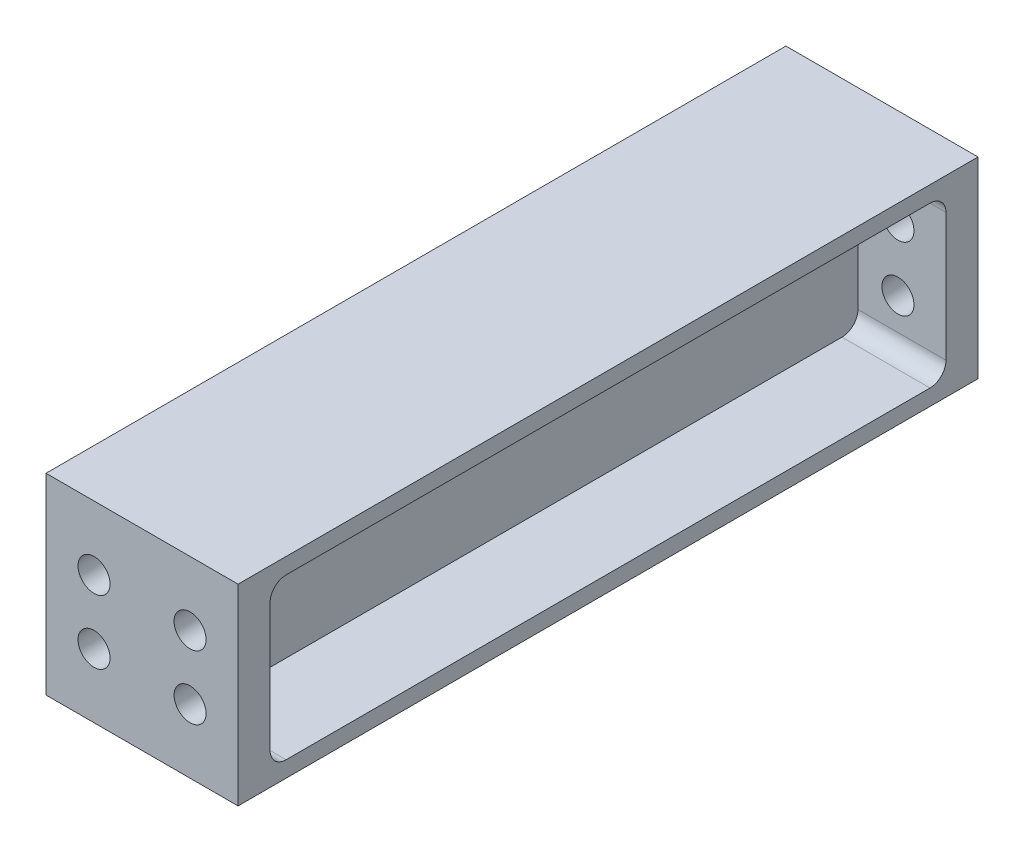
ISO-10303-21;
HEADER;
FILE_DESCRIPTION(('STEP AP214'),'2;1');
FILE_NAME('part.step','',(''),(''),'','','');
FILE_SCHEMA(('AUTOMOTIVE_DESIGN { 1 0 10303 214 1 1 1 1 }'));
ENDSEC;
DATA;
#1=APPLICATION_CONTEXT('core data for automotive mechanical design processes');
#2=APPLICATION_PROTOCOL_DEFINITION('international standard','automotive_design',2000,#1);
#3=PRODUCT_CONTEXT('',#1,'mechanical');
#4=PRODUCT('Part','Part','',(#3));
#5=PRODUCT_RELATED_PRODUCT_CATEGORY('part','',(#4));
#6=PRODUCT_DEFINITION_FORMATION('','',#4);
#7=PRODUCT_DEFINITION_CONTEXT('part definition',#1,'design');
#8=PRODUCT_DEFINITION('design','',#6,#7);
#9=PRODUCT_DEFINITION_SHAPE('','',#8);
#10=(LENGTH_UNIT() NAMED_UNIT(*) SI_UNIT(.MILLI.,.METRE.));
#11=(NAMED_UNIT(*) PLANE_ANGLE_UNIT() SI_UNIT($,.RADIAN.));
#12=(NAMED_UNIT(*) SI_UNIT($,.STERADIAN.) SOLID_ANGLE_UNIT());
#13=UNCERTAINTY_MEASURE_WITH_UNIT(LENGTH_MEASURE(1.E-05),#10,'distance_accuracy_value','');
#14=(GEOMETRIC_REPRESENTATION_CONTEXT(3) GLOBAL_UNCERTAINTY_ASSIGNED_CONTEXT((#13)) GLOBAL_UNIT_ASSIGNED_CONTEXT((#10,
#11,#12)) REPRESENTATION_CONTEXT('',''));
#15=CARTESIAN_POINT('',(0.,0.,0.));
#16=DIRECTION('',(0.,0.,1.));
#17=DIRECTION('',(1.,0.,0.));
#18=AXIS2_PLACEMENT_3D('',#15,#16,#17);
#19=CARTESIAN_POINT('',(0.,0.,146.76501));
#20=DIRECTION('',(1.,0.,0.));
#21=DIRECTION('',(0.,0.,-1.));
#22=AXIS2_PLACEMENT_3D('',#19,#20,#21);
#23=PLANE('',#22);
#24=DIRECTION('',(0.,-1.,0.));
#25=VECTOR('',#24,1.);
#26=CARTESIAN_POINT('',(0.,0.,0.));
#27=LINE('',#26,#25);
#28=CARTESIAN_POINT('',(0.,38.1,0.));
#29=VERTEX_POINT('',#28);
#30=CARTESIAN_POINT('',(0.,0.,0.));
#31=VERTEX_POINT('',#30);
#32=EDGE_CURVE('E196',#29,#31,#27,.T.);
#33=ORIENTED_EDGE('',*,*,#32,.T.);
#34=DIRECTION('',(0.,0.,-1.));
#35=VECTOR('',#34,1.);
#36=CARTESIAN_POINT('',(0.,0.,146.76501));
#37=LINE('',#36,#35);
#38=CARTESIAN_POINT('',(0.,0.,146.76501));
#39=VERTEX_POINT('',#38);
#40=EDGE_CURVE('E177',#39,#31,#37,.T.);
#41=ORIENTED_EDGE('',*,*,#40,.F.);
#42=DIRECTION('',(0.,-1.,0.));
#43=VECTOR('',#42,1.);
#44=CARTESIAN_POINT('',(0.,0.,146.76501));
#45=LINE('',#44,#43);
#46=CARTESIAN_POINT('',(0.,38.1,146.76501));
#47=VERTEX_POINT('',#46);
#48=EDGE_CURVE('E184',#47,#39,#45,.T.);
#49=ORIENTED_EDGE('',*,*,#48,.F.);
#50=DIRECTION('',(0.,0.,-1.));
#51=VECTOR('',#50,1.);
#52=CARTESIAN_POINT('',(0.,38.1,146.76501));
#53=LINE('',#52,#51);
#54=EDGE_CURVE('E347',#47,#29,#53,.T.);
#55=ORIENTED_EDGE('',*,*,#54,.T.);
#56=EDGE_LOOP('',(#33,#41,#49,#55));
#57=FACE_BOUND('',#56,.T.);
#58=DIRECTION('',(0.,0.,1.));
#59=VECTOR('',#58,1.);
#60=CARTESIAN_POINT('',(0.,34.925,140.41501));
#61=LINE('',#60,#59);
#62=CARTESIAN_POINT('',(0.,34.925,9.52499999999998));
#63=VERTEX_POINT('',#62);
#64=CARTESIAN_POINT('',(0.,34.925,137.24001));
#65=VERTEX_POINT('',#64);
#66=EDGE_CURVE('E316',#63,#65,#61,.T.);
#67=ORIENTED_EDGE('',*,*,#66,.T.);
#68=CARTESIAN_POINT('',(0.,31.75,137.24001));
#69=DIRECTION('',(1.,0.,0.));
#70=DIRECTION('',(0.,0.,-1.));
#71=AXIS2_PLACEMENT_3D('',#68,#69,#70);
#72=CIRCLE('',#71,3.175);
#73=CARTESIAN_POINT('',(0.,31.75,140.41501));
#74=VERTEX_POINT('',#73);
#75=EDGE_CURVE('E44',#65,#74,#72,.T.);
#76=ORIENTED_EDGE('',*,*,#75,.T.);
#77=DIRECTION('',(0.,-1.,0.));
#78=VECTOR('',#77,1.);
#79=CARTESIAN_POINT('',(0.,34.925,140.41501));
#80=LINE('',#79,#78);
#81=CARTESIAN_POINT('',(0.,6.35,140.41501));
#82=VERTEX_POINT('',#81);
#83=EDGE_CURVE('E299',#74,#82,#80,.T.);
#84=ORIENTED_EDGE('',*,*,#83,.T.);
#85=CARTESIAN_POINT('',(0.,6.35,137.24001));
#86=DIRECTION('',(1.,0.,0.));
#87=DIRECTION('',(0.,0.,-1.));
#88=AXIS2_PLACEMENT_3D('',#85,#86,#87);
#89=CIRCLE('',#88,3.175);
#90=CARTESIAN_POINT('',(0.,3.175,137.24001));
#91=VERTEX_POINT('',#90);
#92=EDGE_CURVE('E267',#82,#91,#89,.T.);
#93=ORIENTED_EDGE('',*,*,#92,.T.);
#94=DIRECTION('',(0.,0.,-1.));
#95=VECTOR('',#94,1.);
#96=CARTESIAN_POINT('',(0.,3.175,140.41501));
#97=LINE('',#96,#95);
#98=CARTESIAN_POINT('',(0.,3.17499999999998,9.52499999999998));
#99=VERTEX_POINT('',#98);
#100=EDGE_CURVE('E304',#91,#99,#97,.T.);
#101=ORIENTED_EDGE('',*,*,#100,.T.);
#102=CARTESIAN_POINT('',(0.,6.34999999999998,9.52499999999998));
#103=DIRECTION('',(1.,0.,0.));
#104=DIRECTION('',(0.,0.,-1.));
#105=AXIS2_PLACEMENT_3D('',#102,#103,#104);
#106=CIRCLE('',#105,3.175);
#107=CARTESIAN_POINT('',(0.,6.34999999999998,6.34999999999997));
#108=VERTEX_POINT('',#107);
#109=EDGE_CURVE('E265',#99,#108,#106,.T.);
#110=ORIENTED_EDGE('',*,*,#109,.T.);
#111=DIRECTION('',(0.,1.,0.));
#112=VECTOR('',#111,1.);
#113=CARTESIAN_POINT('',(0.,34.925,6.34999999999997));
#114=LINE('',#113,#112);
#115=CARTESIAN_POINT('',(0.,31.75,6.34999999999997));
#116=VERTEX_POINT('',#115);
#117=EDGE_CURVE('E318',#108,#116,#114,.T.);
#118=ORIENTED_EDGE('',*,*,#117,.T.);
#119=CARTESIAN_POINT('',(0.,31.75,9.52499999999997));
#120=DIRECTION('',(1.,0.,0.));
#121=DIRECTION('',(0.,0.,-1.));
#122=AXIS2_PLACEMENT_3D('',#119,#120,#121);
#123=CIRCLE('',#122,3.175);
#124=EDGE_CURVE('E11',#116,#63,#123,.T.);
#125=ORIENTED_EDGE('',*,*,#124,.T.);
#126=EDGE_LOOP('',(#67,#76,#84,#93,#101,#110,#118,#125));
#127=FACE_BOUND('',#126,.T.);
#128=ADVANCED_FACE('F35',(#57,#127),#23,.F.);
#129=CARTESIAN_POINT('',(0.,0.,146.76501));
#130=DIRECTION('',(0.,1.,0.));
#131=DIRECTION('',(0.,0.,1.));
#132=AXIS2_PLACEMENT_3D('',#129,#130,#131);
#133=PLANE('',#132);
#134=DIRECTION('',(1.,0.,0.));
#135=VECTOR('',#134,1.);
#136=CARTESIAN_POINT('',(0.,0.,0.));
#137=LINE('',#136,#135);
#138=CARTESIAN_POINT('',(38.1,0.,0.));
#139=VERTEX_POINT('',#138);
#140=EDGE_CURVE('E349',#31,#139,#137,.T.);
#141=ORIENTED_EDGE('',*,*,#140,.T.);
#142=DIRECTION('',(0.,0.,-1.));
#143=VECTOR('',#142,1.);
#144=CARTESIAN_POINT('',(38.1,0.,146.76501));
#145=LINE('',#144,#143);
#146=CARTESIAN_POINT('',(38.1,0.,146.76501));
#147=VERTEX_POINT('',#146);
#148=EDGE_CURVE('E180',#147,#139,#145,.T.);
#149=ORIENTED_EDGE('',*,*,#148,.F.);
#150=DIRECTION('',(1.,0.,0.));
#151=VECTOR('',#150,1.);
#152=CARTESIAN_POINT('',(0.,0.,146.76501));
#153=LINE('',#152,#151);
#154=EDGE_CURVE('E173',#39,#147,#153,.T.);
#155=ORIENTED_EDGE('',*,*,#154,.F.);
#156=ORIENTED_EDGE('',*,*,#40,.T.);
#157=EDGE_LOOP('',(#141,#149,#155,#156));
#158=FACE_BOUND('',#157,.T.);
#159=ADVANCED_FACE('F175',(#158),#133,.F.);
#160=CARTESIAN_POINT('',(38.1,0.,146.76501));
#161=DIRECTION('',(-1.,0.,0.));
#162=DIRECTION('',(0.,0.,1.));
#163=AXIS2_PLACEMENT_3D('',#160,#161,#162);
#164=PLANE('',#163);
#165=DIRECTION('',(0.,0.,-1.));
#166=VECTOR('',#165,1.);
#167=CARTESIAN_POINT('',(38.1,3.175,140.41501));
#168=LINE('',#167,#166);
#169=CARTESIAN_POINT('',(38.1,3.175,137.24001));
#170=VERTEX_POINT('',#169);
#171=CARTESIAN_POINT('',(38.1,3.17499999999998,9.52499999999998));
#172=VERTEX_POINT('',#171);
#173=EDGE_CURVE('E337',#170,#172,#168,.T.);
#174=ORIENTED_EDGE('',*,*,#173,.F.);
#175=CARTESIAN_POINT('',(38.1,6.35,137.24001));
#176=DIRECTION('',(-1.,0.,0.));
#177=DIRECTION('',(0.,0.,1.));
#178=AXIS2_PLACEMENT_3D('',#175,#176,#177);
#179=CIRCLE('',#178,3.175);
#180=CARTESIAN_POINT('',(38.1,6.35,140.41501));
#181=VERTEX_POINT('',#180);
#182=EDGE_CURVE('E232',#170,#181,#179,.T.);
#183=ORIENTED_EDGE('',*,*,#182,.T.);
#184=DIRECTION('',(0.,-1.,0.));
#185=VECTOR('',#184,1.);
#186=CARTESIAN_POINT('',(38.1,34.925,140.41501));
#187=LINE('',#186,#185);
#188=CARTESIAN_POINT('',(38.1,31.75,140.41501));
#189=VERTEX_POINT('',#188);
#190=EDGE_CURVE('E313',#189,#181,#187,.T.);
#191=ORIENTED_EDGE('',*,*,#190,.F.);
#192=CARTESIAN_POINT('',(38.1,31.75,137.24001));
#193=DIRECTION('',(-1.,0.,0.));
#194=DIRECTION('',(0.,0.,1.));
#195=AXIS2_PLACEMENT_3D('',#192,#193,#194);
#196=CIRCLE('',#195,3.175);
#197=CARTESIAN_POINT('',(38.1,34.925,137.24001));
#198=VERTEX_POINT('',#197);
#199=EDGE_CURVE('E234',#189,#198,#196,.T.);
#200=ORIENTED_EDGE('',*,*,#199,.T.);
#201=DIRECTION('',(0.,0.,1.));
#202=VECTOR('',#201,1.);
#203=CARTESIAN_POINT('',(38.1,34.925,140.41501));
#204=LINE('',#203,#202);
#205=CARTESIAN_POINT('',(38.1,34.925,9.52499999999998));
#206=VERTEX_POINT('',#205);
#207=EDGE_CURVE('E326',#206,#198,#204,.T.);
#208=ORIENTED_EDGE('',*,*,#207,.F.);
#209=CARTESIAN_POINT('',(38.1,31.75,9.52499999999998));
#210=DIRECTION('',(-1.,0.,0.));
#211=DIRECTION('',(0.,0.,1.));
#212=AXIS2_PLACEMENT_3D('',#209,#210,#211);
#213=CIRCLE('',#212,3.175);
#214=CARTESIAN_POINT('',(38.1,31.75,6.34999999999997));
#215=VERTEX_POINT('',#214);
#216=EDGE_CURVE('E236',#206,#215,#213,.T.);
#217=ORIENTED_EDGE('',*,*,#216,.T.);
#218=DIRECTION('',(0.,1.,0.));
#219=VECTOR('',#218,1.);
#220=CARTESIAN_POINT('',(38.1,34.925,6.34999999999997));
#221=LINE('',#220,#219);
#222=CARTESIAN_POINT('',(38.1,6.34999999999998,6.34999999999997));
#223=VERTEX_POINT('',#222);
#224=EDGE_CURVE('E340',#223,#215,#221,.T.);
#225=ORIENTED_EDGE('',*,*,#224,.F.);
#226=CARTESIAN_POINT('',(38.1,6.34999999999998,9.52499999999997));
#227=DIRECTION('',(-1.,0.,0.));
#228=DIRECTION('',(0.,0.,1.));
#229=AXIS2_PLACEMENT_3D('',#226,#227,#228);
#230=CIRCLE('',#229,3.175);
#231=EDGE_CURVE('E230',#223,#172,#230,.T.);
#232=ORIENTED_EDGE('',*,*,#231,.T.);
#233=EDGE_LOOP('',(#174,#183,#191,#200,#208,#217,#225,#232));
#234=FACE_BOUND('',#233,.T.);
#235=DIRECTION('',(0.,1.,0.));
#236=VECTOR('',#235,1.);
#237=CARTESIAN_POINT('',(38.1,0.,0.));
#238=LINE('',#237,#236);
#239=CARTESIAN_POINT('',(38.1,38.1,0.));
#240=VERTEX_POINT('',#239);
#241=EDGE_CURVE('E351',#139,#240,#238,.T.);
#242=ORIENTED_EDGE('',*,*,#241,.T.);
#243=DIRECTION('',(0.,0.,-1.));
#244=VECTOR('',#243,1.);
#245=CARTESIAN_POINT('',(38.1,38.1,146.76501));
#246=LINE('',#245,#244);
#247=CARTESIAN_POINT('',(38.1,38.1,146.76501));
#248=VERTEX_POINT('',#247);
#249=EDGE_CURVE('E201',#248,#240,#246,.T.);
#250=ORIENTED_EDGE('',*,*,#249,.F.);
#251=DIRECTION('',(0.,1.,0.));
#252=VECTOR('',#251,1.);
#253=CARTESIAN_POINT('',(38.1,0.,146.76501));
#254=LINE('',#253,#252);
#255=EDGE_CURVE('E183',#147,#248,#254,.T.);
#256=ORIENTED_EDGE('',*,*,#255,.F.);
#257=ORIENTED_EDGE('',*,*,#148,.T.);
#258=EDGE_LOOP('',(#242,#250,#256,#257));
#259=FACE_BOUND('',#258,.T.);
#260=ADVANCED_FACE('F363',(#234,#259),#164,.F.);
#261=CARTESIAN_POINT('',(0.,38.1,146.76501));
#262=DIRECTION('',(0.,-1.,0.));
#263=DIRECTION('',(0.,0.,-1.));
#264=AXIS2_PLACEMENT_3D('',#261,#262,#263);
#265=PLANE('',#264);
#266=DIRECTION('',(-1.,0.,0.));
#267=VECTOR('',#266,1.);
#268=CARTESIAN_POINT('',(0.,38.1,0.));
#269=LINE('',#268,#267);
#270=EDGE_CURVE('E193',#240,#29,#269,.T.);
#271=ORIENTED_EDGE('',*,*,#270,.T.);
#272=ORIENTED_EDGE('',*,*,#54,.F.);
#273=DIRECTION('',(-1.,0.,0.));
#274=VECTOR('',#273,1.);
#275=CARTESIAN_POINT('',(0.,38.1,146.76501));
#276=LINE('',#275,#274);
#277=EDGE_CURVE('E189',#248,#47,#276,.T.);
#278=ORIENTED_EDGE('',*,*,#277,.F.);
#279=ORIENTED_EDGE('',*,*,#249,.T.);
#280=EDGE_LOOP('',(#271,#272,#278,#279));
#281=FACE_BOUND('',#280,.T.);
#282=ADVANCED_FACE('F358',(#281),#265,.F.);
#283=CARTESIAN_POINT('',(0.,0.,146.76501));
#284=DIRECTION('',(0.,0.,-1.));
#285=DIRECTION('',(-1.,0.,0.));
#286=AXIS2_PLACEMENT_3D('',#283,#284,#285);
#287=PLANE('',#286);
#288=CARTESIAN_POINT('',(9.525,25.4,146.76501));
#289=DIRECTION('',(0.,0.,-1.));
#290=DIRECTION('',(-1.,0.,0.));
#291=AXIS2_PLACEMENT_3D('',#288,#289,#290);
#292=CIRCLE('',#291,3.17499999999993);
#293=CARTESIAN_POINT('',(6.35000000000007,25.4,146.76501));
#294=VERTEX_POINT('',#293);
#295=EDGE_CURVE('E547',#294,#294,#292,.T.);
#296=ORIENTED_EDGE('',*,*,#295,.T.);
#297=EDGE_LOOP('',(#296));
#298=FACE_BOUND('',#297,.T.);
#299=CARTESIAN_POINT('',(9.525,12.7,146.76501));
#300=DIRECTION('',(0.,0.,-1.));
#301=DIRECTION('',(-1.,0.,0.));
#302=AXIS2_PLACEMENT_3D('',#299,#300,#301);
#303=CIRCLE('',#302,3.17499999999993);
#304=CARTESIAN_POINT('',(6.35000000000007,12.7,146.76501));
#305=VERTEX_POINT('',#304);
#306=EDGE_CURVE('E537',#305,#305,#303,.T.);
#307=ORIENTED_EDGE('',*,*,#306,.T.);
#308=EDGE_LOOP('',(#307));
#309=FACE_BOUND('',#308,.T.);
#310=CARTESIAN_POINT('',(28.575,12.7,146.76501));
#311=DIRECTION('',(0.,0.,-1.));
#312=DIRECTION('',(-1.,0.,0.));
#313=AXIS2_PLACEMENT_3D('',#310,#311,#312);
#314=CIRCLE('',#313,3.17499999999993);
#315=CARTESIAN_POINT('',(25.4000000000001,12.7,146.76501));
#316=VERTEX_POINT('',#315);
#317=EDGE_CURVE('E277',#316,#316,#314,.T.);
#318=ORIENTED_EDGE('',*,*,#317,.T.);
#319=EDGE_LOOP('',(#318));
#320=FACE_BOUND('',#319,.T.);
#321=CARTESIAN_POINT('',(28.575,25.4,146.76501));
#322=DIRECTION('',(0.,0.,-1.));
#323=DIRECTION('',(-1.,0.,0.));
#324=AXIS2_PLACEMENT_3D('',#321,#322,#323);
#325=CIRCLE('',#324,3.17499999999993);
#326=CARTESIAN_POINT('',(25.4000000000001,25.4,146.76501));
#327=VERTEX_POINT('',#326);
#328=EDGE_CURVE('E273',#327,#327,#325,.T.);
#329=ORIENTED_EDGE('',*,*,#328,.T.);
#330=EDGE_LOOP('',(#329));
#331=FACE_BOUND('',#330,.T.);
#332=ORIENTED_EDGE('',*,*,#48,.T.);
#333=ORIENTED_EDGE('',*,*,#154,.T.);
#334=ORIENTED_EDGE('',*,*,#255,.T.);
#335=ORIENTED_EDGE('',*,*,#277,.T.);
#336=EDGE_LOOP('',(#332,#333,#334,#335));
#337=FACE_BOUND('',#336,.T.);
#338=ADVANCED_FACE('F187',(#298,#309,#320,#331,#337),#287,.F.);
#339=CARTESIAN_POINT('',(0.,0.,0.));
#340=DIRECTION('',(0.,0.,-1.));
#341=DIRECTION('',(-1.,0.,0.));
#342=AXIS2_PLACEMENT_3D('',#339,#340,#341);
#343=PLANE('',#342);
#344=CARTESIAN_POINT('',(9.525,25.4,0.));
#345=DIRECTION('',(0.,0.,-1.));
#346=DIRECTION('',(-1.,0.,0.));
#347=AXIS2_PLACEMENT_3D('',#344,#345,#346);
#348=CIRCLE('',#347,3.17499999999999);
#349=CARTESIAN_POINT('',(6.35000000000001,25.4,0.));
#350=VERTEX_POINT('',#349);
#351=EDGE_CURVE('E477',#350,#350,#348,.T.);
#352=ORIENTED_EDGE('',*,*,#351,.F.);
#353=EDGE_LOOP('',(#352));
#354=FACE_BOUND('',#353,.T.);
#355=CARTESIAN_POINT('',(9.525,12.7,0.));
#356=DIRECTION('',(0.,0.,-1.));
#357=DIRECTION('',(-1.,0.,0.));
#358=AXIS2_PLACEMENT_3D('',#355,#356,#357);
#359=CIRCLE('',#358,3.17499999999999);
#360=CARTESIAN_POINT('',(6.35000000000001,12.7,0.));
#361=VERTEX_POINT('',#360);
#362=EDGE_CURVE('E481',#361,#361,#359,.T.);
#363=ORIENTED_EDGE('',*,*,#362,.F.);
#364=EDGE_LOOP('',(#363));
#365=FACE_BOUND('',#364,.T.);
#366=CARTESIAN_POINT('',(28.575,12.7,0.));
#367=DIRECTION('',(0.,0.,-1.));
#368=DIRECTION('',(-1.,0.,0.));
#369=AXIS2_PLACEMENT_3D('',#366,#367,#368);
#370=CIRCLE('',#369,3.17499999999998);
#371=CARTESIAN_POINT('',(25.4,12.7,0.));
#372=VERTEX_POINT('',#371);
#373=EDGE_CURVE('E284',#372,#372,#370,.T.);
#374=ORIENTED_EDGE('',*,*,#373,.F.);
#375=EDGE_LOOP('',(#374));
#376=FACE_BOUND('',#375,.T.);
#377=CARTESIAN_POINT('',(28.575,25.4,0.));
#378=DIRECTION('',(0.,0.,-1.));
#379=DIRECTION('',(-1.,0.,0.));
#380=AXIS2_PLACEMENT_3D('',#377,#378,#379);
#381=CIRCLE('',#380,3.17499999999998);
#382=CARTESIAN_POINT('',(25.4,25.4,0.));
#383=VERTEX_POINT('',#382);
#384=EDGE_CURVE('E281',#383,#383,#381,.T.);
#385=ORIENTED_EDGE('',*,*,#384,.F.);
#386=EDGE_LOOP('',(#385));
#387=FACE_BOUND('',#386,.T.);
#388=ORIENTED_EDGE('',*,*,#32,.F.);
#389=ORIENTED_EDGE('',*,*,#270,.F.);
#390=ORIENTED_EDGE('',*,*,#241,.F.);
#391=ORIENTED_EDGE('',*,*,#140,.F.);
#392=EDGE_LOOP('',(#388,#389,#390,#391));
#393=FACE_BOUND('',#392,.T.);
#394=ADVANCED_FACE('F362',(#354,#365,#376,#387,#393),#343,.T.);
#395=CARTESIAN_POINT('',(20.6375,34.925,140.41501));
#396=DIRECTION('',(0.,0.,1.));
#397=DIRECTION('',(1.,0.,0.));
#398=AXIS2_PLACEMENT_3D('',#395,#396,#397);
#399=PLANE('',#398);
#400=CARTESIAN_POINT('',(28.575,12.7,140.41501));
#401=DIRECTION('',(0.,0.,1.));
#402=DIRECTION('',(1.,0.,0.));
#403=AXIS2_PLACEMENT_3D('',#400,#401,#402);
#404=CIRCLE('',#403,3.17499999999996);
#405=CARTESIAN_POINT('',(31.75,12.7,140.41501));
#406=VERTEX_POINT('',#405);
#407=EDGE_CURVE('E276',#406,#406,#404,.T.);
#408=ORIENTED_EDGE('',*,*,#407,.T.);
#409=EDGE_LOOP('',(#408));
#410=FACE_BOUND('',#409,.T.);
#411=CARTESIAN_POINT('',(28.575,25.4,140.41501));
#412=DIRECTION('',(0.,0.,1.));
#413=DIRECTION('',(1.,0.,0.));
#414=AXIS2_PLACEMENT_3D('',#411,#412,#413);
#415=CIRCLE('',#414,3.17499999999996);
#416=CARTESIAN_POINT('',(31.75,25.4,140.41501));
#417=VERTEX_POINT('',#416);
#418=EDGE_CURVE('E270',#417,#417,#415,.T.);
#419=ORIENTED_EDGE('',*,*,#418,.T.);
#420=EDGE_LOOP('',(#419));
#421=FACE_BOUND('',#420,.T.);
#422=ORIENTED_EDGE('',*,*,#190,.T.);
#423=DIRECTION('',(1.,0.,0.));
#424=VECTOR('',#423,1.);
#425=CARTESIAN_POINT('',(20.6375,6.35,140.41501));
#426=LINE('',#425,#424);
#427=CARTESIAN_POINT('',(20.6375,6.35,140.41501));
#428=VERTEX_POINT('',#427);
#429=EDGE_CURVE('E223',#181,#428,#426,.F.);
#430=ORIENTED_EDGE('',*,*,#429,.T.);
#431=DIRECTION('',(0.,-1.,0.));
#432=VECTOR('',#431,1.);
#433=CARTESIAN_POINT('',(20.6375,34.925,140.41501));
#434=LINE('',#433,#432);
#435=CARTESIAN_POINT('',(20.6375,31.75,140.41501));
#436=VERTEX_POINT('',#435);
#437=EDGE_CURVE('E322',#436,#428,#434,.T.);
#438=ORIENTED_EDGE('',*,*,#437,.F.);
#439=DIRECTION('',(1.,0.,0.));
#440=VECTOR('',#439,1.);
#441=CARTESIAN_POINT('',(38.1,31.75,140.41501));
#442=LINE('',#441,#440);
#443=EDGE_CURVE('E220',#436,#189,#442,.T.);
#444=ORIENTED_EDGE('',*,*,#443,.T.);
#445=EDGE_LOOP('',(#422,#430,#438,#444));
#446=FACE_BOUND('',#445,.T.);
#447=ADVANCED_FACE('F457',(#410,#421,#446),#399,.F.);
#448=CARTESIAN_POINT('',(20.6375,34.925,140.41501));
#449=DIRECTION('',(0.,1.,0.));
#450=DIRECTION('',(0.,0.,1.));
#451=AXIS2_PLACEMENT_3D('',#448,#449,#450);
#452=PLANE('',#451);
#453=ORIENTED_EDGE('',*,*,#207,.T.);
#454=DIRECTION('',(1.,0.,0.));
#455=VECTOR('',#454,1.);
#456=CARTESIAN_POINT('',(20.6375,34.925,137.24001));
#457=LINE('',#456,#455);
#458=CARTESIAN_POINT('',(20.6375,34.925,137.24001));
#459=VERTEX_POINT('',#458);
#460=EDGE_CURVE('E228',#198,#459,#457,.F.);
#461=ORIENTED_EDGE('',*,*,#460,.T.);
#462=DIRECTION('',(0.,0.,1.));
#463=VECTOR('',#462,1.);
#464=CARTESIAN_POINT('',(20.6375,34.925,140.41501));
#465=LINE('',#464,#463);
#466=CARTESIAN_POINT('',(20.6375,34.925,9.52499999999998));
#467=VERTEX_POINT('',#466);
#468=EDGE_CURVE('E332',#467,#459,#465,.T.);
#469=ORIENTED_EDGE('',*,*,#468,.F.);
#470=DIRECTION('',(1.,0.,0.));
#471=VECTOR('',#470,1.);
#472=CARTESIAN_POINT('',(38.1,34.925,9.52499999999998));
#473=LINE('',#472,#471);
#474=EDGE_CURVE('E225',#467,#206,#473,.T.);
#475=ORIENTED_EDGE('',*,*,#474,.T.);
#476=EDGE_LOOP('',(#453,#461,#469,#475));
#477=FACE_BOUND('',#476,.T.);
#478=ADVANCED_FACE('F453',(#477),#452,.F.);
#479=CARTESIAN_POINT('',(20.6375,34.925,6.34999999999997));
#480=DIRECTION('',(0.,0.,-1.));
#481=DIRECTION('',(-1.,0.,0.));
#482=AXIS2_PLACEMENT_3D('',#479,#480,#481);
#483=PLANE('',#482);
#484=CARTESIAN_POINT('',(28.575,12.7,6.34999999999997));
#485=DIRECTION('',(0.,0.,-1.));
#486=DIRECTION('',(-1.,0.,0.));
#487=AXIS2_PLACEMENT_3D('',#484,#485,#486);
#488=CIRCLE('',#487,3.17499999999996);
#489=CARTESIAN_POINT('',(25.4,12.7,6.34999999999997));
#490=VERTEX_POINT('',#489);
#491=EDGE_CURVE('E274',#490,#490,#488,.T.);
#492=ORIENTED_EDGE('',*,*,#491,.T.);
#493=EDGE_LOOP('',(#492));
#494=FACE_BOUND('',#493,.T.);
#495=CARTESIAN_POINT('',(28.575,25.4,6.34999999999997));
#496=DIRECTION('',(0.,0.,-1.));
#497=DIRECTION('',(-1.,0.,0.));
#498=AXIS2_PLACEMENT_3D('',#495,#496,#497);
#499=CIRCLE('',#498,3.17499999999996);
#500=CARTESIAN_POINT('',(25.4,25.4,6.34999999999997));
#501=VERTEX_POINT('',#500);
#502=EDGE_CURVE('E272',#501,#501,#499,.T.);
#503=ORIENTED_EDGE('',*,*,#502,.T.);
#504=EDGE_LOOP('',(#503));
#505=FACE_BOUND('',#504,.T.);
#506=DIRECTION('',(0.,1.,0.));
#507=VECTOR('',#506,1.);
#508=CARTESIAN_POINT('',(20.6375,34.925,6.34999999999997));
#509=LINE('',#508,#507);
#510=CARTESIAN_POINT('',(20.6375,6.34999999999998,6.34999999999997));
#511=VERTEX_POINT('',#510);
#512=CARTESIAN_POINT('',(20.6375,31.75,6.34999999999997));
#513=VERTEX_POINT('',#512);
#514=EDGE_CURVE('E329',#511,#513,#509,.T.);
#515=ORIENTED_EDGE('',*,*,#514,.F.);
#516=DIRECTION('',(1.,0.,0.));
#517=VECTOR('',#516,1.);
#518=CARTESIAN_POINT('',(38.1,6.34999999999998,6.34999999999997));
#519=LINE('',#518,#517);
#520=EDGE_CURVE('E199',#511,#223,#519,.T.);
#521=ORIENTED_EDGE('',*,*,#520,.T.);
#522=ORIENTED_EDGE('',*,*,#224,.T.);
#523=DIRECTION('',(1.,0.,0.));
#524=VECTOR('',#523,1.);
#525=CARTESIAN_POINT('',(20.6375,31.75,6.34999999999997));
#526=LINE('',#525,#524);
#527=EDGE_CURVE('E197',#215,#513,#526,.F.);
#528=ORIENTED_EDGE('',*,*,#527,.T.);
#529=EDGE_LOOP('',(#515,#521,#522,#528));
#530=FACE_BOUND('',#529,.T.);
#531=ADVANCED_FACE('F456',(#494,#505,#530),#483,.F.);
#532=CARTESIAN_POINT('',(20.6375,3.175,140.41501));
#533=DIRECTION('',(0.,-1.,0.));
#534=DIRECTION('',(0.,0.,-1.));
#535=AXIS2_PLACEMENT_3D('',#532,#533,#534);
#536=PLANE('',#535);
#537=ORIENTED_EDGE('',*,*,#173,.T.);
#538=DIRECTION('',(1.,0.,0.));
#539=VECTOR('',#538,1.);
#540=CARTESIAN_POINT('',(20.6375,3.17499999999998,9.52499999999997));
#541=LINE('',#540,#539);
#542=CARTESIAN_POINT('',(20.6375,3.17499999999998,9.52499999999998));
#543=VERTEX_POINT('',#542);
#544=EDGE_CURVE('E210',#172,#543,#541,.F.);
#545=ORIENTED_EDGE('',*,*,#544,.T.);
#546=DIRECTION('',(0.,0.,-1.));
#547=VECTOR('',#546,1.);
#548=CARTESIAN_POINT('',(20.6375,3.175,140.41501));
#549=LINE('',#548,#547);
#550=CARTESIAN_POINT('',(20.6375,3.175,137.24001));
#551=VERTEX_POINT('',#550);
#552=EDGE_CURVE('E325',#551,#543,#549,.T.);
#553=ORIENTED_EDGE('',*,*,#552,.F.);
#554=DIRECTION('',(1.,0.,0.));
#555=VECTOR('',#554,1.);
#556=CARTESIAN_POINT('',(38.1,3.175,137.24001));
#557=LINE('',#556,#555);
#558=EDGE_CURVE('E207',#551,#170,#557,.T.);
#559=ORIENTED_EDGE('',*,*,#558,.T.);
#560=EDGE_LOOP('',(#537,#545,#553,#559));
#561=FACE_BOUND('',#560,.T.);
#562=ADVANCED_FACE('F451',(#561),#536,.F.);
#563=CARTESIAN_POINT('',(20.6375,0.,0.));
#564=DIRECTION('',(1.,0.,0.));
#565=DIRECTION('',(0.,0.,-1.));
#566=AXIS2_PLACEMENT_3D('',#563,#564,#565);
#567=PLANE('',#566);
#568=ORIENTED_EDGE('',*,*,#552,.T.);
#569=CARTESIAN_POINT('',(20.6375,6.34999999999998,9.52499999999997));
#570=DIRECTION('',(1.,0.,0.));
#571=DIRECTION('',(0.,0.,-1.));
#572=AXIS2_PLACEMENT_3D('',#569,#570,#571);
#573=CIRCLE('',#572,3.175);
#574=EDGE_CURVE('E218',#543,#511,#573,.T.);
#575=ORIENTED_EDGE('',*,*,#574,.T.);
#576=ORIENTED_EDGE('',*,*,#514,.T.);
#577=CARTESIAN_POINT('',(20.6375,31.75,9.52499999999998));
#578=DIRECTION('',(1.,0.,0.));
#579=DIRECTION('',(0.,0.,-1.));
#580=AXIS2_PLACEMENT_3D('',#577,#578,#579);
#581=CIRCLE('',#580,3.175);
#582=EDGE_CURVE('E212',#513,#467,#581,.T.);
#583=ORIENTED_EDGE('',*,*,#582,.T.);
#584=ORIENTED_EDGE('',*,*,#468,.T.);
#585=CARTESIAN_POINT('',(20.6375,31.75,137.24001));
#586=DIRECTION('',(1.,0.,0.));
#587=DIRECTION('',(0.,0.,-1.));
#588=AXIS2_PLACEMENT_3D('',#585,#586,#587);
#589=CIRCLE('',#588,3.175);
#590=EDGE_CURVE('E214',#459,#436,#589,.T.);
#591=ORIENTED_EDGE('',*,*,#590,.T.);
#592=ORIENTED_EDGE('',*,*,#437,.T.);
#593=CARTESIAN_POINT('',(20.6375,6.35,137.24001));
#594=DIRECTION('',(1.,0.,0.));
#595=DIRECTION('',(0.,0.,-1.));
#596=AXIS2_PLACEMENT_3D('',#593,#594,#595);
#597=CIRCLE('',#596,3.175);
#598=EDGE_CURVE('E216',#428,#551,#597,.T.);
#599=ORIENTED_EDGE('',*,*,#598,.T.);
#600=EDGE_LOOP('',(#568,#575,#576,#583,#584,#591,#592,#599));
#601=FACE_BOUND('',#600,.T.);
#602=ADVANCED_FACE('F383',(#601),#567,.T.);
#603=CARTESIAN_POINT('',(20.6375,6.34999999999998,9.52499999999997));
#604=DIRECTION('',(-1.,0.,0.));
#605=DIRECTION('',(0.,0.,1.));
#606=AXIS2_PLACEMENT_3D('',#603,#604,#605);
#607=CYLINDRICAL_SURFACE('',#606,3.175);
#608=ORIENTED_EDGE('',*,*,#574,.F.);
#609=ORIENTED_EDGE('',*,*,#544,.F.);
#610=ORIENTED_EDGE('',*,*,#231,.F.);
#611=ORIENTED_EDGE('',*,*,#520,.F.);
#612=EDGE_LOOP('',(#608,#609,#610,#611));
#613=FACE_BOUND('',#612,.T.);
#614=ADVANCED_FACE('F379',(#613),#607,.F.);
#615=CARTESIAN_POINT('',(20.6375,6.35,137.24001));
#616=DIRECTION('',(-1.,0.,0.));
#617=DIRECTION('',(0.,0.,1.));
#618=AXIS2_PLACEMENT_3D('',#615,#616,#617);
#619=CYLINDRICAL_SURFACE('',#618,3.175);
#620=ORIENTED_EDGE('',*,*,#598,.F.);
#621=ORIENTED_EDGE('',*,*,#429,.F.);
#622=ORIENTED_EDGE('',*,*,#182,.F.);
#623=ORIENTED_EDGE('',*,*,#558,.F.);
#624=EDGE_LOOP('',(#620,#621,#622,#623));
#625=FACE_BOUND('',#624,.T.);
#626=ADVANCED_FACE('F382',(#625),#619,.F.);
#627=CARTESIAN_POINT('',(20.6375,31.75,137.24001));
#628=DIRECTION('',(-1.,0.,0.));
#629=DIRECTION('',(0.,0.,1.));
#630=AXIS2_PLACEMENT_3D('',#627,#628,#629);
#631=CYLINDRICAL_SURFACE('',#630,3.175);
#632=ORIENTED_EDGE('',*,*,#590,.F.);
#633=ORIENTED_EDGE('',*,*,#460,.F.);
#634=ORIENTED_EDGE('',*,*,#199,.F.);
#635=ORIENTED_EDGE('',*,*,#443,.F.);
#636=EDGE_LOOP('',(#632,#633,#634,#635));
#637=FACE_BOUND('',#636,.T.);
#638=ADVANCED_FACE('F387',(#637),#631,.F.);
#639=CARTESIAN_POINT('',(20.6375,31.75,9.52499999999998));
#640=DIRECTION('',(-1.,0.,0.));
#641=DIRECTION('',(0.,0.,1.));
#642=AXIS2_PLACEMENT_3D('',#639,#640,#641);
#643=CYLINDRICAL_SURFACE('',#642,3.175);
#644=ORIENTED_EDGE('',*,*,#582,.F.);
#645=ORIENTED_EDGE('',*,*,#527,.F.);
#646=ORIENTED_EDGE('',*,*,#216,.F.);
#647=ORIENTED_EDGE('',*,*,#474,.F.);
#648=EDGE_LOOP('',(#644,#645,#646,#647));
#649=FACE_BOUND('',#648,.T.);
#650=ADVANCED_FACE('F391',(#649),#643,.F.);
#651=CARTESIAN_POINT('',(17.4625,34.925,140.41501));
#652=DIRECTION('',(0.,0.,-1.));
#653=DIRECTION('',(-1.,0.,0.));
#654=AXIS2_PLACEMENT_3D('',#651,#652,#653);
#655=PLANE('',#654);
#656=CARTESIAN_POINT('',(9.525,25.4,140.41501));
#657=DIRECTION('',(0.,0.,-1.));
#658=DIRECTION('',(-1.,0.,0.));
#659=AXIS2_PLACEMENT_3D('',#656,#657,#658);
#660=CIRCLE('',#659,3.17499999999996);
#661=CARTESIAN_POINT('',(6.35000000000004,25.4,140.41501));
#662=VERTEX_POINT('',#661);
#663=EDGE_CURVE('E544',#662,#662,#660,.T.);
#664=ORIENTED_EDGE('',*,*,#663,.F.);
#665=EDGE_LOOP('',(#664));
#666=FACE_BOUND('',#665,.T.);
#667=CARTESIAN_POINT('',(9.525,12.7,140.41501));
#668=DIRECTION('',(0.,0.,-1.));
#669=DIRECTION('',(-1.,0.,0.));
#670=AXIS2_PLACEMENT_3D('',#667,#668,#669);
#671=CIRCLE('',#670,3.17499999999996);
#672=CARTESIAN_POINT('',(6.35000000000004,12.7,140.41501));
#673=VERTEX_POINT('',#672);
#674=EDGE_CURVE('E289',#673,#673,#671,.T.);
#675=ORIENTED_EDGE('',*,*,#674,.F.);
#676=EDGE_LOOP('',(#675));
#677=FACE_BOUND('',#676,.T.);
#678=DIRECTION('',(0.,-1.,0.));
#679=VECTOR('',#678,1.);
#680=CARTESIAN_POINT('',(17.4625,34.925,140.41501));
#681=LINE('',#680,#679);
#682=CARTESIAN_POINT('',(17.4625,31.75,140.41501));
#683=VERTEX_POINT('',#682);
#684=CARTESIAN_POINT('',(17.4625,6.35,140.41501));
#685=VERTEX_POINT('',#684);
#686=EDGE_CURVE('E300',#683,#685,#681,.T.);
#687=ORIENTED_EDGE('',*,*,#686,.T.);
#688=DIRECTION('',(-1.,0.,0.));
#689=VECTOR('',#688,1.);
#690=CARTESIAN_POINT('',(0.,6.35,140.41501));
#691=LINE('',#690,#689);
#692=EDGE_CURVE('E258',#685,#82,#691,.T.);
#693=ORIENTED_EDGE('',*,*,#692,.T.);
#694=ORIENTED_EDGE('',*,*,#83,.F.);
#695=DIRECTION('',(-1.,0.,0.));
#696=VECTOR('',#695,1.);
#697=CARTESIAN_POINT('',(17.4625,31.75,140.41501));
#698=LINE('',#697,#696);
#699=EDGE_CURVE('E256',#74,#683,#698,.F.);
#700=ORIENTED_EDGE('',*,*,#699,.T.);
#701=EDGE_LOOP('',(#687,#693,#694,#700));
#702=FACE_BOUND('',#701,.T.);
#703=ADVANCED_FACE('F395',(#666,#677,#702),#655,.T.);
#704=CARTESIAN_POINT('',(17.4625,3.175,140.41501));
#705=DIRECTION('',(0.,1.,0.));
#706=DIRECTION('',(0.,0.,1.));
#707=AXIS2_PLACEMENT_3D('',#704,#705,#706);
#708=PLANE('',#707);
#709=DIRECTION('',(0.,0.,-1.));
#710=VECTOR('',#709,1.);
#711=CARTESIAN_POINT('',(17.4625,3.175,140.41501));
#712=LINE('',#711,#710);
#713=CARTESIAN_POINT('',(17.4625,3.175,137.24001));
#714=VERTEX_POINT('',#713);
#715=CARTESIAN_POINT('',(17.4625,3.17499999999998,9.52499999999998));
#716=VERTEX_POINT('',#715);
#717=EDGE_CURVE('E310',#714,#716,#712,.T.);
#718=ORIENTED_EDGE('',*,*,#717,.T.);
#719=DIRECTION('',(-1.,0.,0.));
#720=VECTOR('',#719,1.);
#721=CARTESIAN_POINT('',(0.,3.17499999999998,9.52499999999998));
#722=LINE('',#721,#720);
#723=EDGE_CURVE('E240',#716,#99,#722,.T.);
#724=ORIENTED_EDGE('',*,*,#723,.T.);
#725=ORIENTED_EDGE('',*,*,#100,.F.);
#726=DIRECTION('',(-1.,0.,0.));
#727=VECTOR('',#726,1.);
#728=CARTESIAN_POINT('',(17.4625,3.175,137.24001));
#729=LINE('',#728,#727);
#730=EDGE_CURVE('E238',#91,#714,#729,.F.);
#731=ORIENTED_EDGE('',*,*,#730,.T.);
#732=EDGE_LOOP('',(#718,#724,#725,#731));
#733=FACE_BOUND('',#732,.T.);
#734=ADVANCED_FACE('F431',(#733),#708,.T.);
#735=CARTESIAN_POINT('',(17.4625,34.925,6.34999999999997));
#736=DIRECTION('',(0.,0.,1.));
#737=DIRECTION('',(1.,0.,0.));
#738=AXIS2_PLACEMENT_3D('',#735,#736,#737);
#739=PLANE('',#738);
#740=CARTESIAN_POINT('',(9.525,25.4,6.34999999999997));
#741=DIRECTION('',(0.,0.,1.));
#742=DIRECTION('',(1.,0.,0.));
#743=AXIS2_PLACEMENT_3D('',#740,#741,#742);
#744=CIRCLE('',#743,3.17499999999996);
#745=CARTESIAN_POINT('',(12.7,25.4,6.34999999999997));
#746=VERTEX_POINT('',#745);
#747=EDGE_CURVE('E39',#746,#746,#744,.T.);
#748=ORIENTED_EDGE('',*,*,#747,.F.);
#749=EDGE_LOOP('',(#748));
#750=FACE_BOUND('',#749,.T.);
#751=CARTESIAN_POINT('',(9.525,12.7,6.34999999999997));
#752=DIRECTION('',(0.,0.,1.));
#753=DIRECTION('',(1.,0.,0.));
#754=AXIS2_PLACEMENT_3D('',#751,#752,#753);
#755=CIRCLE('',#754,3.17499999999996);
#756=CARTESIAN_POINT('',(12.7,12.7,6.34999999999997));
#757=VERTEX_POINT('',#756);
#758=EDGE_CURVE('E535',#757,#757,#755,.T.);
#759=ORIENTED_EDGE('',*,*,#758,.F.);
#760=EDGE_LOOP('',(#759));
#761=FACE_BOUND('',#760,.T.);
#762=ORIENTED_EDGE('',*,*,#117,.F.);
#763=DIRECTION('',(-1.,0.,0.));
#764=VECTOR('',#763,1.);
#765=CARTESIAN_POINT('',(17.4625,6.34999999999998,6.34999999999997));
#766=LINE('',#765,#764);
#767=CARTESIAN_POINT('',(17.4625,6.34999999999998,6.34999999999997));
#768=VERTEX_POINT('',#767);
#769=EDGE_CURVE('E246',#108,#768,#766,.F.);
#770=ORIENTED_EDGE('',*,*,#769,.T.);
#771=DIRECTION('',(0.,1.,0.));
#772=VECTOR('',#771,1.);
#773=CARTESIAN_POINT('',(17.4625,34.925,6.34999999999997));
#774=LINE('',#773,#772);
#775=CARTESIAN_POINT('',(17.4625,31.75,6.34999999999997));
#776=VERTEX_POINT('',#775);
#777=EDGE_CURVE('E307',#768,#776,#774,.T.);
#778=ORIENTED_EDGE('',*,*,#777,.T.);
#779=DIRECTION('',(-1.,0.,0.));
#780=VECTOR('',#779,1.);
#781=CARTESIAN_POINT('',(0.,31.75,6.34999999999997));
#782=LINE('',#781,#780);
#783=EDGE_CURVE('E243',#776,#116,#782,.T.);
#784=ORIENTED_EDGE('',*,*,#783,.T.);
#785=EDGE_LOOP('',(#762,#770,#778,#784));
#786=FACE_BOUND('',#785,.T.);
#787=ADVANCED_FACE('F425',(#750,#761,#786),#739,.T.);
#788=CARTESIAN_POINT('',(17.4625,34.925,140.41501));
#789=DIRECTION('',(0.,-1.,0.));
#790=DIRECTION('',(0.,0.,-1.));
#791=AXIS2_PLACEMENT_3D('',#788,#789,#790);
#792=PLANE('',#791);
#793=DIRECTION('',(0.,0.,1.));
#794=VECTOR('',#793,1.);
#795=CARTESIAN_POINT('',(17.4625,34.925,140.41501));
#796=LINE('',#795,#794);
#797=CARTESIAN_POINT('',(17.4625,34.925,9.52499999999998));
#798=VERTEX_POINT('',#797);
#799=CARTESIAN_POINT('',(17.4625,34.925,137.24001));
#800=VERTEX_POINT('',#799);
#801=EDGE_CURVE('E303',#798,#800,#796,.T.);
#802=ORIENTED_EDGE('',*,*,#801,.T.);
#803=DIRECTION('',(-1.,0.,0.));
#804=VECTOR('',#803,1.);
#805=CARTESIAN_POINT('',(0.,34.925,137.24001));
#806=LINE('',#805,#804);
#807=EDGE_CURVE('E263',#800,#65,#806,.T.);
#808=ORIENTED_EDGE('',*,*,#807,.T.);
#809=ORIENTED_EDGE('',*,*,#66,.F.);
#810=DIRECTION('',(-1.,0.,0.));
#811=VECTOR('',#810,1.);
#812=CARTESIAN_POINT('',(17.4625,34.925,9.52499999999997));
#813=LINE('',#812,#811);
#814=EDGE_CURVE('E261',#63,#798,#813,.F.);
#815=ORIENTED_EDGE('',*,*,#814,.T.);
#816=EDGE_LOOP('',(#802,#808,#809,#815));
#817=FACE_BOUND('',#816,.T.);
#818=ADVANCED_FACE('F419',(#817),#792,.T.);
#819=CARTESIAN_POINT('',(17.4625,0.,0.));
#820=DIRECTION('',(-1.,0.,0.));
#821=DIRECTION('',(0.,0.,-1.));
#822=AXIS2_PLACEMENT_3D('',#819,#820,#821);
#823=PLANE('',#822);
#824=ORIENTED_EDGE('',*,*,#777,.F.);
#825=CARTESIAN_POINT('',(17.4625,6.34999999999998,9.52499999999998));
#826=DIRECTION('',(-1.,0.,0.));
#827=DIRECTION('',(0.,0.,1.));
#828=AXIS2_PLACEMENT_3D('',#825,#826,#827);
#829=CIRCLE('',#828,3.175);
#830=EDGE_CURVE('E254',#768,#716,#829,.T.);
#831=ORIENTED_EDGE('',*,*,#830,.T.);
#832=ORIENTED_EDGE('',*,*,#717,.F.);
#833=CARTESIAN_POINT('',(17.4625,6.35,137.24001));
#834=DIRECTION('',(-1.,0.,0.));
#835=DIRECTION('',(0.,0.,1.));
#836=AXIS2_PLACEMENT_3D('',#833,#834,#835);
#837=CIRCLE('',#836,3.175);
#838=EDGE_CURVE('E252',#714,#685,#837,.T.);
#839=ORIENTED_EDGE('',*,*,#838,.T.);
#840=ORIENTED_EDGE('',*,*,#686,.F.);
#841=CARTESIAN_POINT('',(17.4625,31.75,137.24001));
#842=DIRECTION('',(-1.,0.,0.));
#843=DIRECTION('',(0.,0.,1.));
#844=AXIS2_PLACEMENT_3D('',#841,#842,#843);
#845=CIRCLE('',#844,3.175);
#846=EDGE_CURVE('E250',#683,#800,#845,.T.);
#847=ORIENTED_EDGE('',*,*,#846,.T.);
#848=ORIENTED_EDGE('',*,*,#801,.F.);
#849=CARTESIAN_POINT('',(17.4625,31.75,9.52499999999997));
#850=DIRECTION('',(-1.,0.,0.));
#851=DIRECTION('',(0.,0.,1.));
#852=AXIS2_PLACEMENT_3D('',#849,#850,#851);
#853=CIRCLE('',#852,3.175);
#854=EDGE_CURVE('E248',#798,#776,#853,.T.);
#855=ORIENTED_EDGE('',*,*,#854,.T.);
#856=EDGE_LOOP('',(#824,#831,#832,#839,#840,#847,#848,#855));
#857=FACE_BOUND('',#856,.T.);
#858=ADVANCED_FACE('F401',(#857),#823,.T.);
#859=CARTESIAN_POINT('',(17.4625,6.34999999999998,9.52499999999998));
#860=DIRECTION('',(1.,0.,0.));
#861=DIRECTION('',(0.,0.,-1.));
#862=AXIS2_PLACEMENT_3D('',#859,#860,#861);
#863=CYLINDRICAL_SURFACE('',#862,3.175);
#864=ORIENTED_EDGE('',*,*,#830,.F.);
#865=ORIENTED_EDGE('',*,*,#769,.F.);
#866=ORIENTED_EDGE('',*,*,#109,.F.);
#867=ORIENTED_EDGE('',*,*,#723,.F.);
#868=EDGE_LOOP('',(#864,#865,#866,#867));
#869=FACE_BOUND('',#868,.T.);
#870=ADVANCED_FACE('F397',(#869),#863,.F.);
#871=CARTESIAN_POINT('',(17.4625,6.35,137.24001));
#872=DIRECTION('',(1.,0.,0.));
#873=DIRECTION('',(0.,0.,-1.));
#874=AXIS2_PLACEMENT_3D('',#871,#872,#873);
#875=CYLINDRICAL_SURFACE('',#874,3.175);
#876=ORIENTED_EDGE('',*,*,#838,.F.);
#877=ORIENTED_EDGE('',*,*,#730,.F.);
#878=ORIENTED_EDGE('',*,*,#92,.F.);
#879=ORIENTED_EDGE('',*,*,#692,.F.);
#880=EDGE_LOOP('',(#876,#877,#878,#879));
#881=FACE_BOUND('',#880,.T.);
#882=ADVANCED_FACE('F400',(#881),#875,.F.);
#883=CARTESIAN_POINT('',(17.4625,31.75,137.24001));
#884=DIRECTION('',(1.,0.,0.));
#885=DIRECTION('',(0.,0.,-1.));
#886=AXIS2_PLACEMENT_3D('',#883,#884,#885);
#887=CYLINDRICAL_SURFACE('',#886,3.175);
#888=ORIENTED_EDGE('',*,*,#846,.F.);
#889=ORIENTED_EDGE('',*,*,#699,.F.);
#890=ORIENTED_EDGE('',*,*,#75,.F.);
#891=ORIENTED_EDGE('',*,*,#807,.F.);
#892=EDGE_LOOP('',(#888,#889,#890,#891));
#893=FACE_BOUND('',#892,.T.);
#894=ADVANCED_FACE('F404',(#893),#887,.F.);
#895=CARTESIAN_POINT('',(17.4625,31.75,9.52499999999997));
#896=DIRECTION('',(1.,0.,0.));
#897=DIRECTION('',(0.,0.,-1.));
#898=AXIS2_PLACEMENT_3D('',#895,#896,#897);
#899=CYLINDRICAL_SURFACE('',#898,3.175);
#900=ORIENTED_EDGE('',*,*,#854,.F.);
#901=ORIENTED_EDGE('',*,*,#814,.F.);
#902=ORIENTED_EDGE('',*,*,#124,.F.);
#903=ORIENTED_EDGE('',*,*,#783,.F.);
#904=EDGE_LOOP('',(#900,#901,#902,#903));
#905=FACE_BOUND('',#904,.T.);
#906=ADVANCED_FACE('F37',(#905),#899,.F.);
#907=CARTESIAN_POINT('',(28.575,25.4,0.));
#908=DIRECTION('',(0.,0.,-1.));
#909=DIRECTION('',(-1.,0.,0.));
#910=AXIS2_PLACEMENT_3D('',#907,#908,#909);
#911=CYLINDRICAL_SURFACE('',#910,3.17499999999996);
#912=ORIENTED_EDGE('',*,*,#328,.F.);
#913=EDGE_LOOP('',(#912));
#914=FACE_BOUND('',#913,.T.);
#915=ORIENTED_EDGE('',*,*,#418,.F.);
#916=EDGE_LOOP('',(#915));
#917=FACE_BOUND('',#916,.T.);
#918=ADVANCED_FACE('F410',(#914,#917),#911,.F.);
#919=ORIENTED_EDGE('',*,*,#384,.T.);
#920=EDGE_LOOP('',(#919));
#921=FACE_BOUND('',#920,.T.);
#922=ORIENTED_EDGE('',*,*,#502,.F.);
#923=EDGE_LOOP('',(#922));
#924=FACE_BOUND('',#923,.T.);
#925=ADVANCED_FACE('F486',(#921,#924),#911,.F.);
#926=CARTESIAN_POINT('',(28.575,12.7,0.));
#927=DIRECTION('',(0.,0.,-1.));
#928=DIRECTION('',(-1.,0.,0.));
#929=AXIS2_PLACEMENT_3D('',#926,#927,#928);
#930=CYLINDRICAL_SURFACE('',#929,3.17499999999996);
#931=ORIENTED_EDGE('',*,*,#373,.T.);
#932=EDGE_LOOP('',(#931));
#933=FACE_BOUND('',#932,.T.);
#934=ORIENTED_EDGE('',*,*,#491,.F.);
#935=EDGE_LOOP('',(#934));
#936=FACE_BOUND('',#935,.T.);
#937=ADVANCED_FACE('F489',(#933,#936),#930,.F.);
#938=ORIENTED_EDGE('',*,*,#317,.F.);
#939=EDGE_LOOP('',(#938));
#940=FACE_BOUND('',#939,.T.);
#941=ORIENTED_EDGE('',*,*,#407,.F.);
#942=EDGE_LOOP('',(#941));
#943=FACE_BOUND('',#942,.T.);
#944=ADVANCED_FACE('F518',(#940,#943),#930,.F.);
#945=CARTESIAN_POINT('',(9.525,12.7,0.));
#946=DIRECTION('',(0.,0.,-1.));
#947=DIRECTION('',(-1.,0.,0.));
#948=AXIS2_PLACEMENT_3D('',#945,#946,#947);
#949=CYLINDRICAL_SURFACE('',#948,3.17499999999996);
#950=ORIENTED_EDGE('',*,*,#758,.T.);
#951=EDGE_LOOP('',(#950));
#952=FACE_BOUND('',#951,.T.);
#953=ORIENTED_EDGE('',*,*,#362,.T.);
#954=EDGE_LOOP('',(#953));
#955=FACE_BOUND('',#954,.T.);
#956=ADVANCED_FACE('F562',(#952,#955),#949,.F.);
#957=ORIENTED_EDGE('',*,*,#674,.T.);
#958=EDGE_LOOP('',(#957));
#959=FACE_BOUND('',#958,.T.);
#960=ORIENTED_EDGE('',*,*,#306,.F.);
#961=EDGE_LOOP('',(#960));
#962=FACE_BOUND('',#961,.T.);
#963=ADVANCED_FACE('F554',(#959,#962),#949,.F.);
#964=CARTESIAN_POINT('',(9.525,25.4,0.));
#965=DIRECTION('',(0.,0.,-1.));
#966=DIRECTION('',(-1.,0.,0.));
#967=AXIS2_PLACEMENT_3D('',#964,#965,#966);
#968=CYLINDRICAL_SURFACE('',#967,3.17499999999996);
#969=ORIENTED_EDGE('',*,*,#747,.T.);
#970=EDGE_LOOP('',(#969));
#971=FACE_BOUND('',#970,.T.);
#972=ORIENTED_EDGE('',*,*,#351,.T.);
#973=EDGE_LOOP('',(#972));
#974=FACE_BOUND('',#973,.T.);
#975=ADVANCED_FACE('F551',(#971,#974),#968,.F.);
#976=ORIENTED_EDGE('',*,*,#663,.T.);
#977=EDGE_LOOP('',(#976));
#978=FACE_BOUND('',#977,.T.);
#979=ORIENTED_EDGE('',*,*,#295,.F.);
#980=EDGE_LOOP('',(#979));
#981=FACE_BOUND('',#980,.T.);
#982=ADVANCED_FACE('F553',(#978,#981),#968,.F.);
#983=CLOSED_SHELL('',(#128,#159,#260,#282,#338,#394,#447,#478,#531,#562,#602,#614,#626,#638,
#650,#703,#734,#787,#818,#858,#870,#882,#894,#906,#918,#925,#937,#944,#956,#963,#975,#982));
#984=MANIFOLD_SOLID_BREP('B2',#983);
#985=ADVANCED_BREP_SHAPE_REPRESENTATION('',(#18,#984),#14);
#986=SHAPE_DEFINITION_REPRESENTATION(#9,#985);
ENDSEC;
END-ISO-10303-21;
